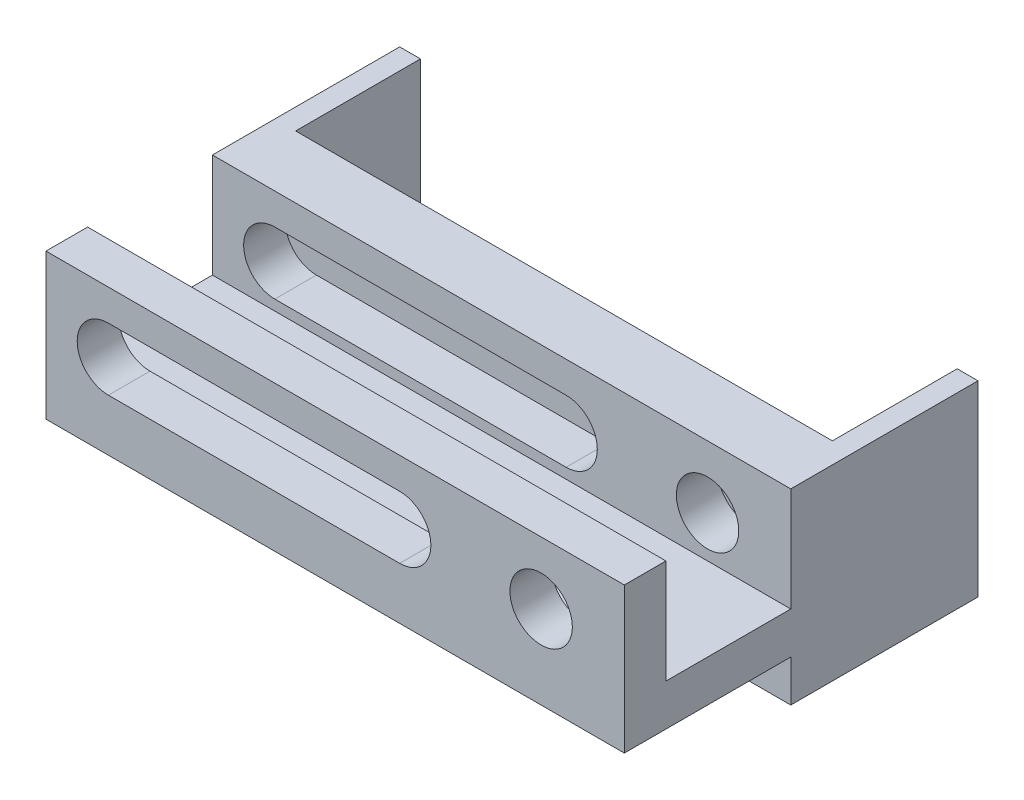
ISO-10303-21;
HEADER;
FILE_DESCRIPTION(('STEP AP214'),'2;1');
FILE_NAME('part.step','',(''),(''),'','','');
FILE_SCHEMA(('AUTOMOTIVE_DESIGN { 1 0 10303 214 1 1 1 1 }'));
ENDSEC;
DATA;
#1=APPLICATION_CONTEXT('core data for automotive mechanical design processes');
#2=APPLICATION_PROTOCOL_DEFINITION('international standard','automotive_design',2000,#1);
#3=PRODUCT_CONTEXT('',#1,'mechanical');
#4=PRODUCT('Part','Part','',(#3));
#5=PRODUCT_RELATED_PRODUCT_CATEGORY('part','',(#4));
#6=PRODUCT_DEFINITION_FORMATION('','',#4);
#7=PRODUCT_DEFINITION_CONTEXT('part definition',#1,'design');
#8=PRODUCT_DEFINITION('design','',#6,#7);
#9=PRODUCT_DEFINITION_SHAPE('','',#8);
#10=(LENGTH_UNIT() NAMED_UNIT(*) SI_UNIT(.MILLI.,.METRE.));
#11=(NAMED_UNIT(*) PLANE_ANGLE_UNIT() SI_UNIT($,.RADIAN.));
#12=(NAMED_UNIT(*) SI_UNIT($,.STERADIAN.) SOLID_ANGLE_UNIT());
#13=UNCERTAINTY_MEASURE_WITH_UNIT(LENGTH_MEASURE(1.E-05),#10,'distance_accuracy_value','');
#14=(GEOMETRIC_REPRESENTATION_CONTEXT(3) GLOBAL_UNCERTAINTY_ASSIGNED_CONTEXT((#13)) GLOBAL_UNIT_ASSIGNED_CONTEXT((#10,
#11,#12)) REPRESENTATION_CONTEXT('',''));
#15=CARTESIAN_POINT('',(0.,0.,0.));
#16=DIRECTION('',(0.,0.,1.));
#17=DIRECTION('',(1.,0.,0.));
#18=AXIS2_PLACEMENT_3D('',#15,#16,#17);
#19=CARTESIAN_POINT('',(139.,0.,-47.1919082003113));
#20=DIRECTION('',(0.,-1.,0.));
#21=DIRECTION('',(0.,0.,-1.));
#22=AXIS2_PLACEMENT_3D('',#19,#20,#21);
#23=PLANE('',#22);
#24=DIRECTION('',(0.,0.,-1.));
#25=VECTOR('',#24,1.);
#26=CARTESIAN_POINT('',(5.,0.,-12.1919082003113));
#27=LINE('',#26,#25);
#28=CARTESIAN_POINT('',(5.,0.,-17.1919082003113));
#29=VERTEX_POINT('',#28);
#30=CARTESIAN_POINT('',(5.,0.,-47.1919082003113));
#31=VERTEX_POINT('',#30);
#32=EDGE_CURVE('E64',#29,#31,#27,.T.);
#33=ORIENTED_EDGE('',*,*,#32,.F.);
#34=DIRECTION('',(-1.,0.,0.));
#35=VECTOR('',#34,1.);
#36=CARTESIAN_POINT('',(5.,0.,-17.1919082003113));
#37=LINE('',#36,#35);
#38=CARTESIAN_POINT('',(134.,0.,-17.1919082003113));
#39=VERTEX_POINT('',#38);
#40=EDGE_CURVE('E202',#39,#29,#37,.T.);
#41=ORIENTED_EDGE('',*,*,#40,.F.);
#42=DIRECTION('',(0.,0.,1.));
#43=VECTOR('',#42,1.);
#44=CARTESIAN_POINT('',(134.,0.,-12.1919082003113));
#45=LINE('',#44,#43);
#46=CARTESIAN_POINT('',(134.,0.,-47.1919082003113));
#47=VERTEX_POINT('',#46);
#48=EDGE_CURVE('E220',#47,#39,#45,.T.);
#49=ORIENTED_EDGE('',*,*,#48,.F.);
#50=DIRECTION('',(-1.,0.,0.));
#51=VECTOR('',#50,1.);
#52=CARTESIAN_POINT('',(139.,0.,-47.1919082003113));
#53=LINE('',#52,#51);
#54=EDGE_CURVE('E359',#47,#31,#53,.T.);
#55=ORIENTED_EDGE('',*,*,#54,.T.);
#56=EDGE_LOOP('',(#33,#41,#49,#55));
#57=FACE_BOUND('',#56,.T.);
#58=ADVANCED_FACE('F41',(#57),#23,.F.);
#59=CARTESIAN_POINT('',(139.,0.,37.8080917996887));
#60=DIRECTION('',(0.,1.,0.));
#61=DIRECTION('',(0.,0.,1.));
#62=AXIS2_PLACEMENT_3D('',#59,#60,#61);
#63=PLANE('',#62);
#64=DIRECTION('',(0.,0.,-1.));
#65=VECTOR('',#64,1.);
#66=CARTESIAN_POINT('',(0.,0.,37.8080917996887));
#67=LINE('',#66,#65);
#68=CARTESIAN_POINT('',(0.,0.,37.8080917996887));
#69=VERTEX_POINT('',#68);
#70=CARTESIAN_POINT('',(0.,0.,-2.19190820031126));
#71=VERTEX_POINT('',#70);
#72=EDGE_CURVE('E299',#69,#71,#67,.T.);
#73=ORIENTED_EDGE('',*,*,#72,.T.);
#74=DIRECTION('',(-1.,0.,0.));
#75=VECTOR('',#74,1.);
#76=CARTESIAN_POINT('',(139.,0.,-2.19190820031126));
#77=LINE('',#76,#75);
#78=CARTESIAN_POINT('',(139.,0.,-2.19190820031126));
#79=VERTEX_POINT('',#78);
#80=EDGE_CURVE('E11',#79,#71,#77,.T.);
#81=ORIENTED_EDGE('',*,*,#80,.F.);
#82=DIRECTION('',(0.,0.,-1.));
#83=VECTOR('',#82,1.);
#84=CARTESIAN_POINT('',(139.,0.,37.8080917996887));
#85=LINE('',#84,#83);
#86=CARTESIAN_POINT('',(139.,0.,37.8080917996887));
#87=VERTEX_POINT('',#86);
#88=EDGE_CURVE('E300',#87,#79,#85,.T.);
#89=ORIENTED_EDGE('',*,*,#88,.F.);
#90=DIRECTION('',(-1.,0.,0.));
#91=VECTOR('',#90,1.);
#92=CARTESIAN_POINT('',(139.,0.,37.8080917996887));
#93=LINE('',#92,#91);
#94=EDGE_CURVE('E322',#87,#69,#93,.T.);
#95=ORIENTED_EDGE('',*,*,#94,.T.);
#96=EDGE_LOOP('',(#73,#81,#89,#95));
#97=FACE_BOUND('',#96,.T.);
#98=ADVANCED_FACE('F43',(#97),#63,.F.);
#99=CARTESIAN_POINT('',(139.,0.,-2.19190820031126));
#100=DIRECTION('',(0.,0.,-1.));
#101=DIRECTION('',(0.,1.,0.));
#102=AXIS2_PLACEMENT_3D('',#99,#100,#101);
#103=PLANE('',#102);
#104=DIRECTION('',(0.,-1.,0.));
#105=VECTOR('',#104,1.);
#106=CARTESIAN_POINT('',(0.,0.,-2.19190820031126));
#107=LINE('',#106,#105);
#108=CARTESIAN_POINT('',(0.,-9.99999999999998,-2.19190820031126));
#109=VERTEX_POINT('',#108);
#110=EDGE_CURVE('E325',#71,#109,#107,.T.);
#111=ORIENTED_EDGE('',*,*,#110,.T.);
#112=DIRECTION('',(-1.,0.,0.));
#113=VECTOR('',#112,1.);
#114=CARTESIAN_POINT('',(139.,-9.99999999999998,-2.19190820031126));
#115=LINE('',#114,#113);
#116=CARTESIAN_POINT('',(139.,-9.99999999999998,-2.19190820031126));
#117=VERTEX_POINT('',#116);
#118=EDGE_CURVE('E49',#117,#109,#115,.T.);
#119=ORIENTED_EDGE('',*,*,#118,.F.);
#120=DIRECTION('',(0.,-1.,0.));
#121=VECTOR('',#120,1.);
#122=CARTESIAN_POINT('',(139.,0.,-2.19190820031126));
#123=LINE('',#122,#121);
#124=EDGE_CURVE('E303',#79,#117,#123,.T.);
#125=ORIENTED_EDGE('',*,*,#124,.F.);
#126=ORIENTED_EDGE('',*,*,#80,.T.);
#127=EDGE_LOOP('',(#111,#119,#125,#126));
#128=FACE_BOUND('',#127,.T.);
#129=ADVANCED_FACE('F412',(#128),#103,.F.);
#130=CARTESIAN_POINT('',(139.,-9.99999999999998,-2.19190820031126));
#131=DIRECTION('',(0.,1.,0.));
#132=DIRECTION('',(0.,0.,1.));
#133=AXIS2_PLACEMENT_3D('',#130,#131,#132);
#134=PLANE('',#133);
#135=DIRECTION('',(0.,0.,-1.));
#136=VECTOR('',#135,1.);
#137=CARTESIAN_POINT('',(0.,-9.99999999999998,-2.19190820031126));
#138=LINE('',#137,#136);
#139=CARTESIAN_POINT('',(0.,-9.99999999999998,-47.1919082003113));
#140=VERTEX_POINT('',#139);
#141=EDGE_CURVE('E327',#109,#140,#138,.T.);
#142=ORIENTED_EDGE('',*,*,#141,.T.);
#143=DIRECTION('',(-1.,0.,0.));
#144=VECTOR('',#143,1.);
#145=CARTESIAN_POINT('',(139.,-9.99999999999998,-47.1919082003113));
#146=LINE('',#145,#144);
#147=CARTESIAN_POINT('',(139.,-9.99999999999998,-47.1919082003113));
#148=VERTEX_POINT('',#147);
#149=EDGE_CURVE('E361',#148,#140,#146,.T.);
#150=ORIENTED_EDGE('',*,*,#149,.F.);
#151=DIRECTION('',(0.,0.,-1.));
#152=VECTOR('',#151,1.);
#153=CARTESIAN_POINT('',(139.,-9.99999999999998,-2.19190820031126));
#154=LINE('',#153,#152);
#155=EDGE_CURVE('E306',#117,#148,#154,.T.);
#156=ORIENTED_EDGE('',*,*,#155,.F.);
#157=ORIENTED_EDGE('',*,*,#118,.T.);
#158=EDGE_LOOP('',(#142,#150,#156,#157));
#159=FACE_BOUND('',#158,.T.);
#160=ADVANCED_FACE('F368',(#159),#134,.F.);
#161=CARTESIAN_POINT('',(139.,-9.99999999999998,-47.1919082003113));
#162=DIRECTION('',(0.,0.,1.));
#163=DIRECTION('',(1.,0.,0.));
#164=AXIS2_PLACEMENT_3D('',#161,#162,#163);
#165=PLANE('',#164);
#166=DIRECTION('',(0.,1.,0.));
#167=VECTOR('',#166,1.);
#168=CARTESIAN_POINT('',(0.,-9.99999999999998,-47.1919082003113));
#169=LINE('',#168,#167);
#170=CARTESIAN_POINT('',(0.,35.0000000000001,-47.1919082003113));
#171=VERTEX_POINT('',#170);
#172=EDGE_CURVE('E329',#140,#171,#169,.T.);
#173=ORIENTED_EDGE('',*,*,#172,.T.);
#174=DIRECTION('',(1.,0.,0.));
#175=VECTOR('',#174,1.);
#176=CARTESIAN_POINT('',(0.,35.0000000000001,-47.1919082003113));
#177=LINE('',#176,#175);
#178=CARTESIAN_POINT('',(5.,35.0000000000001,-47.1919082003113));
#179=VERTEX_POINT('',#178);
#180=EDGE_CURVE('E209',#171,#179,#177,.T.);
#181=ORIENTED_EDGE('',*,*,#180,.T.);
#182=DIRECTION('',(0.,-1.,0.));
#183=VECTOR('',#182,1.);
#184=CARTESIAN_POINT('',(5.,70.3553390593274,-47.1919082003113));
#185=LINE('',#184,#183);
#186=EDGE_CURVE('E206',#179,#31,#185,.T.);
#187=ORIENTED_EDGE('',*,*,#186,.T.);
#188=ORIENTED_EDGE('',*,*,#54,.F.);
#189=DIRECTION('',(0.,-1.,0.));
#190=VECTOR('',#189,1.);
#191=CARTESIAN_POINT('',(134.,70.3553390593274,-47.1919082003113));
#192=LINE('',#191,#190);
#193=CARTESIAN_POINT('',(134.,35.0000000000001,-47.1919082003113));
#194=VERTEX_POINT('',#193);
#195=EDGE_CURVE('E222',#194,#47,#192,.T.);
#196=ORIENTED_EDGE('',*,*,#195,.F.);
#197=DIRECTION('',(1.,0.,0.));
#198=VECTOR('',#197,1.);
#199=CARTESIAN_POINT('',(139.,35.0000000000001,-47.1919082003113));
#200=LINE('',#199,#198);
#201=CARTESIAN_POINT('',(139.,35.0000000000001,-47.1919082003113));
#202=VERTEX_POINT('',#201);
#203=EDGE_CURVE('E226',#194,#202,#200,.T.);
#204=ORIENTED_EDGE('',*,*,#203,.T.);
#205=DIRECTION('',(0.,1.,0.));
#206=VECTOR('',#205,1.);
#207=CARTESIAN_POINT('',(139.,-9.99999999999998,-47.1919082003113));
#208=LINE('',#207,#206);
#209=EDGE_CURVE('E308',#148,#202,#208,.T.);
#210=ORIENTED_EDGE('',*,*,#209,.F.);
#211=ORIENTED_EDGE('',*,*,#149,.T.);
#212=EDGE_LOOP('',(#173,#181,#187,#188,#196,#204,#210,#211));
#213=FACE_BOUND('',#212,.T.);
#214=ADVANCED_FACE('F378',(#213),#165,.F.);
#215=CARTESIAN_POINT('',(139.,35.,-2.19190820031126));
#216=DIRECTION('',(0.,-1.,0.));
#217=DIRECTION('',(0.,0.,-1.));
#218=AXIS2_PLACEMENT_3D('',#215,#216,#217);
#219=PLANE('',#218);
#220=DIRECTION('',(0.,0.,1.));
#221=VECTOR('',#220,1.);
#222=CARTESIAN_POINT('',(0.,35.,-2.19190820031126));
#223=LINE('',#222,#221);
#224=CARTESIAN_POINT('',(0.,35.,-2.19190820031126));
#225=VERTEX_POINT('',#224);
#226=EDGE_CURVE('E331',#171,#225,#223,.T.);
#227=ORIENTED_EDGE('',*,*,#226,.T.);
#228=DIRECTION('',(-1.,0.,0.));
#229=VECTOR('',#228,1.);
#230=CARTESIAN_POINT('',(139.,35.,-2.19190820031126));
#231=LINE('',#230,#229);
#232=CARTESIAN_POINT('',(139.,35.,-2.19190820031126));
#233=VERTEX_POINT('',#232);
#234=EDGE_CURVE('E356',#233,#225,#231,.T.);
#235=ORIENTED_EDGE('',*,*,#234,.F.);
#236=DIRECTION('',(0.,0.,1.));
#237=VECTOR('',#236,1.);
#238=CARTESIAN_POINT('',(139.,35.,-2.19190820031126));
#239=LINE('',#238,#237);
#240=EDGE_CURVE('E310',#202,#233,#239,.T.);
#241=ORIENTED_EDGE('',*,*,#240,.F.);
#242=ORIENTED_EDGE('',*,*,#203,.F.);
#243=DIRECTION('',(0.,0.,-1.));
#244=VECTOR('',#243,1.);
#245=CARTESIAN_POINT('',(134.,35.,-12.1919082003113));
#246=LINE('',#245,#244);
#247=CARTESIAN_POINT('',(134.,35.,-17.1919082003113));
#248=VERTEX_POINT('',#247);
#249=EDGE_CURVE('E196',#248,#194,#246,.T.);
#250=ORIENTED_EDGE('',*,*,#249,.F.);
#251=DIRECTION('',(1.,0.,0.));
#252=VECTOR('',#251,1.);
#253=CARTESIAN_POINT('',(5.,35.,-17.1919082003113));
#254=LINE('',#253,#252);
#255=CARTESIAN_POINT('',(5.,35.,-17.1919082003113));
#256=VERTEX_POINT('',#255);
#257=EDGE_CURVE('E56',#256,#248,#254,.T.);
#258=ORIENTED_EDGE('',*,*,#257,.F.);
#259=DIRECTION('',(0.,0.,1.));
#260=VECTOR('',#259,1.);
#261=CARTESIAN_POINT('',(5.,35.,-12.1919082003113));
#262=LINE('',#261,#260);
#263=EDGE_CURVE('E194',#179,#256,#262,.T.);
#264=ORIENTED_EDGE('',*,*,#263,.F.);
#265=ORIENTED_EDGE('',*,*,#180,.F.);
#266=EDGE_LOOP('',(#227,#235,#241,#242,#250,#258,#264,#265));
#267=FACE_BOUND('',#266,.T.);
#268=ADVANCED_FACE('F191',(#267),#219,.F.);
#269=CARTESIAN_POINT('',(139.,10.,-2.19190820031126));
#270=DIRECTION('',(0.,0.,-1.));
#271=DIRECTION('',(0.,1.,0.));
#272=AXIS2_PLACEMENT_3D('',#269,#270,#271);
#273=PLANE('',#272);
#274=CARTESIAN_POINT('',(119.,20.,-2.19190820031126));
#275=DIRECTION('',(0.,0.,-1.));
#276=DIRECTION('',(0.,1.,0.));
#277=AXIS2_PLACEMENT_3D('',#274,#275,#276);
#278=CIRCLE('',#277,7.49999999999998);
#279=CARTESIAN_POINT('',(119.,27.5,-2.19190820031126));
#280=VERTEX_POINT('',#279);
#281=EDGE_CURVE('E296',#280,#280,#278,.T.);
#282=ORIENTED_EDGE('',*,*,#281,.T.);
#283=EDGE_LOOP('',(#282));
#284=FACE_BOUND('',#283,.T.);
#285=DIRECTION('',(1.,0.,0.));
#286=VECTOR('',#285,1.);
#287=CARTESIAN_POINT('',(139.,27.5,-2.19190820031126));
#288=LINE('',#287,#286);
#289=CARTESIAN_POINT('',(15.,27.5,-2.19190820031126));
#290=VERTEX_POINT('',#289);
#291=CARTESIAN_POINT('',(85.,27.5,-2.19190820031126));
#292=VERTEX_POINT('',#291);
#293=EDGE_CURVE('E284',#290,#292,#288,.T.);
#294=ORIENTED_EDGE('',*,*,#293,.T.);
#295=CARTESIAN_POINT('',(85.,20.,-2.19190820031126));
#296=DIRECTION('',(0.,0.,-1.));
#297=DIRECTION('',(0.,1.,0.));
#298=AXIS2_PLACEMENT_3D('',#295,#296,#297);
#299=CIRCLE('',#298,7.5);
#300=CARTESIAN_POINT('',(85.,12.5,-2.19190820031126));
#301=VERTEX_POINT('',#300);
#302=EDGE_CURVE('E290',#292,#301,#299,.T.);
#303=ORIENTED_EDGE('',*,*,#302,.T.);
#304=DIRECTION('',(-1.,0.,0.));
#305=VECTOR('',#304,1.);
#306=CARTESIAN_POINT('',(139.,12.5,-2.19190820031126));
#307=LINE('',#306,#305);
#308=CARTESIAN_POINT('',(15.,12.5,-2.19190820031126));
#309=VERTEX_POINT('',#308);
#310=EDGE_CURVE('E272',#301,#309,#307,.T.);
#311=ORIENTED_EDGE('',*,*,#310,.T.);
#312=CARTESIAN_POINT('',(15.,20.,-2.19190820031126));
#313=DIRECTION('',(0.,0.,-1.));
#314=DIRECTION('',(0.,1.,0.));
#315=AXIS2_PLACEMENT_3D('',#312,#313,#314);
#316=CIRCLE('',#315,7.5);
#317=EDGE_CURVE('E278',#309,#290,#316,.T.);
#318=ORIENTED_EDGE('',*,*,#317,.T.);
#319=EDGE_LOOP('',(#294,#303,#311,#318));
#320=FACE_BOUND('',#319,.T.);
#321=DIRECTION('',(0.,-1.,0.));
#322=VECTOR('',#321,1.);
#323=CARTESIAN_POINT('',(0.,10.,-2.19190820031126));
#324=LINE('',#323,#322);
#325=CARTESIAN_POINT('',(0.,10.,-2.19190820031126));
#326=VERTEX_POINT('',#325);
#327=EDGE_CURVE('E333',#225,#326,#324,.T.);
#328=ORIENTED_EDGE('',*,*,#327,.T.);
#329=DIRECTION('',(-1.,0.,0.));
#330=VECTOR('',#329,1.);
#331=CARTESIAN_POINT('',(139.,10.,-2.19190820031126));
#332=LINE('',#331,#330);
#333=CARTESIAN_POINT('',(139.,10.,-2.19190820031126));
#334=VERTEX_POINT('',#333);
#335=EDGE_CURVE('E353',#334,#326,#332,.T.);
#336=ORIENTED_EDGE('',*,*,#335,.F.);
#337=DIRECTION('',(0.,-1.,0.));
#338=VECTOR('',#337,1.);
#339=CARTESIAN_POINT('',(139.,10.,-2.19190820031126));
#340=LINE('',#339,#338);
#341=EDGE_CURVE('E312',#233,#334,#340,.T.);
#342=ORIENTED_EDGE('',*,*,#341,.F.);
#343=ORIENTED_EDGE('',*,*,#234,.T.);
#344=EDGE_LOOP('',(#328,#336,#342,#343));
#345=FACE_BOUND('',#344,.T.);
#346=ADVANCED_FACE('F388',(#284,#320,#345),#273,.F.);
#347=CARTESIAN_POINT('',(139.,10.,27.8080917996887));
#348=DIRECTION('',(0.,-1.,0.));
#349=DIRECTION('',(0.,0.,-1.));
#350=AXIS2_PLACEMENT_3D('',#347,#348,#349);
#351=PLANE('',#350);
#352=DIRECTION('',(0.,0.,1.));
#353=VECTOR('',#352,1.);
#354=CARTESIAN_POINT('',(0.,10.,27.8080917996887));
#355=LINE('',#354,#353);
#356=CARTESIAN_POINT('',(0.,10.,27.8080917996887));
#357=VERTEX_POINT('',#356);
#358=EDGE_CURVE('E335',#326,#357,#355,.T.);
#359=ORIENTED_EDGE('',*,*,#358,.T.);
#360=DIRECTION('',(-1.,0.,0.));
#361=VECTOR('',#360,1.);
#362=CARTESIAN_POINT('',(139.,10.,27.8080917996887));
#363=LINE('',#362,#361);
#364=CARTESIAN_POINT('',(139.,10.,27.8080917996887));
#365=VERTEX_POINT('',#364);
#366=EDGE_CURVE('E350',#365,#357,#363,.T.);
#367=ORIENTED_EDGE('',*,*,#366,.F.);
#368=DIRECTION('',(0.,0.,1.));
#369=VECTOR('',#368,1.);
#370=CARTESIAN_POINT('',(139.,10.,27.8080917996887));
#371=LINE('',#370,#369);
#372=EDGE_CURVE('E314',#334,#365,#371,.T.);
#373=ORIENTED_EDGE('',*,*,#372,.F.);
#374=ORIENTED_EDGE('',*,*,#335,.T.);
#375=EDGE_LOOP('',(#359,#367,#373,#374));
#376=FACE_BOUND('',#375,.T.);
#377=ADVANCED_FACE('F394',(#376),#351,.F.);
#378=CARTESIAN_POINT('',(139.,35.,27.8080917996887));
#379=DIRECTION('',(0.,0.,1.));
#380=DIRECTION('',(0.,-1.,0.));
#381=AXIS2_PLACEMENT_3D('',#378,#379,#380);
#382=PLANE('',#381);
#383=CARTESIAN_POINT('',(119.,20.,27.8080917996887));
#384=DIRECTION('',(0.,0.,1.));
#385=DIRECTION('',(0.,-1.,0.));
#386=AXIS2_PLACEMENT_3D('',#383,#384,#385);
#387=CIRCLE('',#386,7.49999999999998);
#388=CARTESIAN_POINT('',(119.,12.5,27.8080917996887));
#389=VERTEX_POINT('',#388);
#390=EDGE_CURVE('E293',#389,#389,#387,.T.);
#391=ORIENTED_EDGE('',*,*,#390,.T.);
#392=EDGE_LOOP('',(#391));
#393=FACE_BOUND('',#392,.T.);
#394=DIRECTION('',(1.,0.,0.));
#395=VECTOR('',#394,1.);
#396=CARTESIAN_POINT('',(139.,12.5,27.8080917996887));
#397=LINE('',#396,#395);
#398=CARTESIAN_POINT('',(15.,12.5,27.8080917996887));
#399=VERTEX_POINT('',#398);
#400=CARTESIAN_POINT('',(85.,12.5,27.8080917996887));
#401=VERTEX_POINT('',#400);
#402=EDGE_CURVE('E233',#399,#401,#397,.T.);
#403=ORIENTED_EDGE('',*,*,#402,.T.);
#404=CARTESIAN_POINT('',(85.,20.,27.8080917996887));
#405=DIRECTION('',(0.,0.,1.));
#406=DIRECTION('',(0.,-1.,0.));
#407=AXIS2_PLACEMENT_3D('',#404,#405,#406);
#408=CIRCLE('',#407,7.5);
#409=CARTESIAN_POINT('',(85.,27.5,27.8080917996887));
#410=VERTEX_POINT('',#409);
#411=EDGE_CURVE('E287',#401,#410,#408,.T.);
#412=ORIENTED_EDGE('',*,*,#411,.T.);
#413=DIRECTION('',(-1.,0.,0.));
#414=VECTOR('',#413,1.);
#415=CARTESIAN_POINT('',(139.,27.5,27.8080917996887));
#416=LINE('',#415,#414);
#417=CARTESIAN_POINT('',(15.,27.5,27.8080917996887));
#418=VERTEX_POINT('',#417);
#419=EDGE_CURVE('E281',#410,#418,#416,.T.);
#420=ORIENTED_EDGE('',*,*,#419,.T.);
#421=CARTESIAN_POINT('',(15.,20.,27.8080917996887));
#422=DIRECTION('',(0.,0.,1.));
#423=DIRECTION('',(0.,-1.,0.));
#424=AXIS2_PLACEMENT_3D('',#421,#422,#423);
#425=CIRCLE('',#424,7.5);
#426=EDGE_CURVE('E275',#418,#399,#425,.T.);
#427=ORIENTED_EDGE('',*,*,#426,.T.);
#428=EDGE_LOOP('',(#403,#412,#420,#427));
#429=FACE_BOUND('',#428,.T.);
#430=DIRECTION('',(0.,1.,0.));
#431=VECTOR('',#430,1.);
#432=CARTESIAN_POINT('',(0.,35.,27.8080917996887));
#433=LINE('',#432,#431);
#434=CARTESIAN_POINT('',(0.,35.,27.8080917996887));
#435=VERTEX_POINT('',#434);
#436=EDGE_CURVE('E337',#357,#435,#433,.T.);
#437=ORIENTED_EDGE('',*,*,#436,.T.);
#438=DIRECTION('',(-1.,0.,0.));
#439=VECTOR('',#438,1.);
#440=CARTESIAN_POINT('',(139.,35.,27.8080917996887));
#441=LINE('',#440,#439);
#442=CARTESIAN_POINT('',(139.,35.,27.8080917996887));
#443=VERTEX_POINT('',#442);
#444=EDGE_CURVE('E347',#443,#435,#441,.T.);
#445=ORIENTED_EDGE('',*,*,#444,.F.);
#446=DIRECTION('',(0.,1.,0.));
#447=VECTOR('',#446,1.);
#448=CARTESIAN_POINT('',(139.,35.,27.8080917996887));
#449=LINE('',#448,#447);
#450=EDGE_CURVE('E316',#365,#443,#449,.T.);
#451=ORIENTED_EDGE('',*,*,#450,.F.);
#452=ORIENTED_EDGE('',*,*,#366,.T.);
#453=EDGE_LOOP('',(#437,#445,#451,#452));
#454=FACE_BOUND('',#453,.T.);
#455=ADVANCED_FACE('F398',(#393,#429,#454),#382,.F.);
#456=CARTESIAN_POINT('',(139.,35.,37.8080917996887));
#457=DIRECTION('',(0.,-1.,0.));
#458=DIRECTION('',(0.,0.,-1.));
#459=AXIS2_PLACEMENT_3D('',#456,#457,#458);
#460=PLANE('',#459);
#461=DIRECTION('',(0.,0.,1.));
#462=VECTOR('',#461,1.);
#463=CARTESIAN_POINT('',(0.,35.,37.8080917996887));
#464=LINE('',#463,#462);
#465=CARTESIAN_POINT('',(0.,35.,37.8080917996887));
#466=VERTEX_POINT('',#465);
#467=EDGE_CURVE('E339',#435,#466,#464,.T.);
#468=ORIENTED_EDGE('',*,*,#467,.T.);
#469=DIRECTION('',(-1.,0.,0.));
#470=VECTOR('',#469,1.);
#471=CARTESIAN_POINT('',(139.,35.,37.8080917996887));
#472=LINE('',#471,#470);
#473=CARTESIAN_POINT('',(139.,35.,37.8080917996887));
#474=VERTEX_POINT('',#473);
#475=EDGE_CURVE('E344',#474,#466,#472,.T.);
#476=ORIENTED_EDGE('',*,*,#475,.F.);
#477=DIRECTION('',(0.,0.,1.));
#478=VECTOR('',#477,1.);
#479=CARTESIAN_POINT('',(139.,35.,37.8080917996887));
#480=LINE('',#479,#478);
#481=EDGE_CURVE('E318',#443,#474,#480,.T.);
#482=ORIENTED_EDGE('',*,*,#481,.F.);
#483=ORIENTED_EDGE('',*,*,#444,.T.);
#484=EDGE_LOOP('',(#468,#476,#482,#483));
#485=FACE_BOUND('',#484,.T.);
#486=ADVANCED_FACE('F403',(#485),#460,.F.);
#487=CARTESIAN_POINT('',(139.,0.,37.8080917996887));
#488=DIRECTION('',(0.,0.,-1.));
#489=DIRECTION('',(-1.,0.,0.));
#490=AXIS2_PLACEMENT_3D('',#487,#488,#489);
#491=PLANE('',#490);
#492=CARTESIAN_POINT('',(119.,20.,37.8080917996887));
#493=DIRECTION('',(0.,0.,-1.));
#494=DIRECTION('',(0.,1.,0.));
#495=AXIS2_PLACEMENT_3D('',#492,#493,#494);
#496=CIRCLE('',#495,7.49999999999998);
#497=CARTESIAN_POINT('',(119.,27.5,37.8080917996887));
#498=VERTEX_POINT('',#497);
#499=EDGE_CURVE('E230',#498,#498,#496,.T.);
#500=ORIENTED_EDGE('',*,*,#499,.T.);
#501=EDGE_LOOP('',(#500));
#502=FACE_BOUND('',#501,.T.);
#503=DIRECTION('',(1.,0.,0.));
#504=VECTOR('',#503,1.);
#505=CARTESIAN_POINT('',(85.,27.5,37.8080917996888));
#506=LINE('',#505,#504);
#507=CARTESIAN_POINT('',(15.,27.5,37.8080917996888));
#508=VERTEX_POINT('',#507);
#509=CARTESIAN_POINT('',(85.,27.5,37.8080917996888));
#510=VERTEX_POINT('',#509);
#511=EDGE_CURVE('E237',#508,#510,#506,.T.);
#512=ORIENTED_EDGE('',*,*,#511,.T.);
#513=CARTESIAN_POINT('',(85.,20.,37.8080917996887));
#514=DIRECTION('',(0.,0.,-1.));
#515=DIRECTION('',(0.,1.,0.));
#516=AXIS2_PLACEMENT_3D('',#513,#514,#515);
#517=CIRCLE('',#516,7.5);
#518=CARTESIAN_POINT('',(85.,12.5,37.8080917996887));
#519=VERTEX_POINT('',#518);
#520=EDGE_CURVE('E252',#510,#519,#517,.T.);
#521=ORIENTED_EDGE('',*,*,#520,.T.);
#522=DIRECTION('',(-1.,0.,0.));
#523=VECTOR('',#522,1.);
#524=CARTESIAN_POINT('',(85.,12.5,37.8080917996887));
#525=LINE('',#524,#523);
#526=CARTESIAN_POINT('',(15.,12.5,37.8080917996887));
#527=VERTEX_POINT('',#526);
#528=EDGE_CURVE('E265',#519,#527,#525,.T.);
#529=ORIENTED_EDGE('',*,*,#528,.T.);
#530=CARTESIAN_POINT('',(15.,20.,37.8080917996887));
#531=DIRECTION('',(0.,0.,-1.));
#532=DIRECTION('',(0.,1.,0.));
#533=AXIS2_PLACEMENT_3D('',#530,#531,#532);
#534=CIRCLE('',#533,7.5);
#535=EDGE_CURVE('E262',#527,#508,#534,.T.);
#536=ORIENTED_EDGE('',*,*,#535,.T.);
#537=EDGE_LOOP('',(#512,#521,#529,#536));
#538=FACE_BOUND('',#537,.T.);
#539=DIRECTION('',(0.,-1.,0.));
#540=VECTOR('',#539,1.);
#541=CARTESIAN_POINT('',(0.,0.,37.8080917996887));
#542=LINE('',#541,#540);
#543=EDGE_CURVE('E304',#466,#69,#542,.T.);
#544=ORIENTED_EDGE('',*,*,#543,.T.);
#545=ORIENTED_EDGE('',*,*,#94,.F.);
#546=DIRECTION('',(0.,-1.,0.));
#547=VECTOR('',#546,1.);
#548=CARTESIAN_POINT('',(139.,0.,37.8080917996887));
#549=LINE('',#548,#547);
#550=EDGE_CURVE('E320',#474,#87,#549,.T.);
#551=ORIENTED_EDGE('',*,*,#550,.F.);
#552=ORIENTED_EDGE('',*,*,#475,.T.);
#553=EDGE_LOOP('',(#544,#545,#551,#552));
#554=FACE_BOUND('',#553,.T.);
#555=ADVANCED_FACE('F409',(#502,#538,#554),#491,.F.);
#556=CARTESIAN_POINT('',(139.,0.,0.));
#557=DIRECTION('',(-1.,0.,0.));
#558=DIRECTION('',(0.,0.,1.));
#559=AXIS2_PLACEMENT_3D('',#556,#557,#558);
#560=PLANE('',#559);
#561=ORIENTED_EDGE('',*,*,#88,.T.);
#562=ORIENTED_EDGE('',*,*,#124,.T.);
#563=ORIENTED_EDGE('',*,*,#155,.T.);
#564=ORIENTED_EDGE('',*,*,#209,.T.);
#565=ORIENTED_EDGE('',*,*,#240,.T.);
#566=ORIENTED_EDGE('',*,*,#341,.T.);
#567=ORIENTED_EDGE('',*,*,#372,.T.);
#568=ORIENTED_EDGE('',*,*,#450,.T.);
#569=ORIENTED_EDGE('',*,*,#481,.T.);
#570=ORIENTED_EDGE('',*,*,#550,.T.);
#571=EDGE_LOOP('',(#561,#562,#563,#564,#565,#566,#567,#568,#569,#570));
#572=FACE_BOUND('',#571,.T.);
#573=ADVANCED_FACE('F383',(#572),#560,.F.);
#574=CARTESIAN_POINT('',(0.,0.,0.));
#575=DIRECTION('',(-1.,0.,0.));
#576=DIRECTION('',(0.,0.,1.));
#577=AXIS2_PLACEMENT_3D('',#574,#575,#576);
#578=PLANE('',#577);
#579=ORIENTED_EDGE('',*,*,#72,.F.);
#580=ORIENTED_EDGE('',*,*,#543,.F.);
#581=ORIENTED_EDGE('',*,*,#467,.F.);
#582=ORIENTED_EDGE('',*,*,#436,.F.);
#583=ORIENTED_EDGE('',*,*,#358,.F.);
#584=ORIENTED_EDGE('',*,*,#327,.F.);
#585=ORIENTED_EDGE('',*,*,#226,.F.);
#586=ORIENTED_EDGE('',*,*,#172,.F.);
#587=ORIENTED_EDGE('',*,*,#141,.F.);
#588=ORIENTED_EDGE('',*,*,#110,.F.);
#589=EDGE_LOOP('',(#579,#580,#581,#582,#583,#584,#585,#586,#587,#588));
#590=FACE_BOUND('',#589,.T.);
#591=ADVANCED_FACE('F374',(#590),#578,.T.);
#592=CARTESIAN_POINT('',(85.,12.5,37.8080917996887));
#593=DIRECTION('',(0.,-1.,0.));
#594=DIRECTION('',(0.,0.,-1.));
#595=AXIS2_PLACEMENT_3D('',#592,#593,#594);
#596=PLANE('',#595);
#597=DIRECTION('',(0.,0.,-1.));
#598=VECTOR('',#597,1.);
#599=CARTESIAN_POINT('',(15.,12.5,37.8080917996887));
#600=LINE('',#599,#598);
#601=EDGE_CURVE('E239',#527,#399,#600,.T.);
#602=ORIENTED_EDGE('',*,*,#601,.F.);
#603=ORIENTED_EDGE('',*,*,#528,.F.);
#604=DIRECTION('',(0.,0.,-1.));
#605=VECTOR('',#604,1.);
#606=CARTESIAN_POINT('',(85.,12.5,37.8080917996887));
#607=LINE('',#606,#605);
#608=EDGE_CURVE('E235',#519,#401,#607,.T.);
#609=ORIENTED_EDGE('',*,*,#608,.T.);
#610=ORIENTED_EDGE('',*,*,#402,.F.);
#611=EDGE_LOOP('',(#602,#603,#609,#610));
#612=FACE_BOUND('',#611,.T.);
#613=ADVANCED_FACE('F454',(#612),#596,.F.);
#614=CARTESIAN_POINT('',(15.,20.,37.8080917996887));
#615=DIRECTION('',(0.,0.,-1.));
#616=DIRECTION('',(0.,1.,0.));
#617=AXIS2_PLACEMENT_3D('',#614,#615,#616);
#618=CYLINDRICAL_SURFACE('',#617,7.5);
#619=DIRECTION('',(0.,0.,-1.));
#620=VECTOR('',#619,1.);
#621=CARTESIAN_POINT('',(15.,27.5,37.8080917996888));
#622=LINE('',#621,#620);
#623=EDGE_CURVE('E243',#508,#418,#622,.T.);
#624=ORIENTED_EDGE('',*,*,#623,.F.);
#625=ORIENTED_EDGE('',*,*,#535,.F.);
#626=ORIENTED_EDGE('',*,*,#601,.T.);
#627=ORIENTED_EDGE('',*,*,#426,.F.);
#628=EDGE_LOOP('',(#624,#625,#626,#627));
#629=FACE_BOUND('',#628,.T.);
#630=ADVANCED_FACE('F467',(#629),#618,.F.);
#631=CARTESIAN_POINT('',(85.,27.5,37.8080917996888));
#632=DIRECTION('',(0.,1.,0.));
#633=DIRECTION('',(0.,0.,1.));
#634=AXIS2_PLACEMENT_3D('',#631,#632,#633);
#635=PLANE('',#634);
#636=DIRECTION('',(0.,0.,-1.));
#637=VECTOR('',#636,1.);
#638=CARTESIAN_POINT('',(85.,27.5,37.8080917996888));
#639=LINE('',#638,#637);
#640=EDGE_CURVE('E212',#510,#410,#639,.T.);
#641=ORIENTED_EDGE('',*,*,#640,.F.);
#642=ORIENTED_EDGE('',*,*,#511,.F.);
#643=ORIENTED_EDGE('',*,*,#623,.T.);
#644=ORIENTED_EDGE('',*,*,#419,.F.);
#645=EDGE_LOOP('',(#641,#642,#643,#644));
#646=FACE_BOUND('',#645,.T.);
#647=ADVANCED_FACE('F462',(#646),#635,.F.);
#648=CARTESIAN_POINT('',(85.,20.,37.8080917996887));
#649=DIRECTION('',(0.,0.,-1.));
#650=DIRECTION('',(0.,1.,0.));
#651=AXIS2_PLACEMENT_3D('',#648,#649,#650);
#652=CYLINDRICAL_SURFACE('',#651,7.5);
#653=ORIENTED_EDGE('',*,*,#608,.F.);
#654=ORIENTED_EDGE('',*,*,#520,.F.);
#655=ORIENTED_EDGE('',*,*,#640,.T.);
#656=ORIENTED_EDGE('',*,*,#411,.F.);
#657=EDGE_LOOP('',(#653,#654,#655,#656));
#658=FACE_BOUND('',#657,.T.);
#659=ADVANCED_FACE('F475',(#658),#652,.F.);
#660=CARTESIAN_POINT('',(119.,20.,37.8080917996887));
#661=DIRECTION('',(0.,0.,-1.));
#662=DIRECTION('',(0.,1.,0.));
#663=AXIS2_PLACEMENT_3D('',#660,#661,#662);
#664=CYLINDRICAL_SURFACE('',#663,7.49999999999998);
#665=ORIENTED_EDGE('',*,*,#499,.F.);
#666=EDGE_LOOP('',(#665));
#667=FACE_BOUND('',#666,.T.);
#668=ORIENTED_EDGE('',*,*,#390,.F.);
#669=EDGE_LOOP('',(#668));
#670=FACE_BOUND('',#669,.T.);
#671=ADVANCED_FACE('F473',(#667,#670),#664,.F.);
#672=CARTESIAN_POINT('',(85.,27.5,-12.1919082003113));
#673=VERTEX_POINT('',#672);
#674=EDGE_CURVE('E208',#292,#673,#639,.T.);
#675=ORIENTED_EDGE('',*,*,#674,.T.);
#676=CARTESIAN_POINT('',(85.,20.,-12.1919082003113));
#677=DIRECTION('',(0.,0.,-1.));
#678=DIRECTION('',(0.,1.,0.));
#679=AXIS2_PLACEMENT_3D('',#676,#677,#678);
#680=CIRCLE('',#679,7.5);
#681=CARTESIAN_POINT('',(85.,12.5,-12.1919082003113));
#682=VERTEX_POINT('',#681);
#683=EDGE_CURVE('E234',#673,#682,#680,.T.);
#684=ORIENTED_EDGE('',*,*,#683,.T.);
#685=EDGE_CURVE('E238',#301,#682,#607,.T.);
#686=ORIENTED_EDGE('',*,*,#685,.F.);
#687=ORIENTED_EDGE('',*,*,#302,.F.);
#688=EDGE_LOOP('',(#675,#684,#686,#687));
#689=FACE_BOUND('',#688,.T.);
#690=ADVANCED_FACE('F460',(#689),#652,.F.);
#691=CARTESIAN_POINT('',(15.,27.5,-12.1919082003113));
#692=VERTEX_POINT('',#691);
#693=EDGE_CURVE('E245',#290,#692,#622,.T.);
#694=ORIENTED_EDGE('',*,*,#693,.T.);
#695=DIRECTION('',(1.,0.,0.));
#696=VECTOR('',#695,1.);
#697=CARTESIAN_POINT('',(85.,27.5,-12.1919082003112));
#698=LINE('',#697,#696);
#699=EDGE_CURVE('E248',#692,#673,#698,.T.);
#700=ORIENTED_EDGE('',*,*,#699,.T.);
#701=ORIENTED_EDGE('',*,*,#674,.F.);
#702=ORIENTED_EDGE('',*,*,#293,.F.);
#703=EDGE_LOOP('',(#694,#700,#701,#702));
#704=FACE_BOUND('',#703,.T.);
#705=ADVANCED_FACE('F456',(#704),#635,.F.);
#706=CARTESIAN_POINT('',(15.,12.5,-12.1919082003113));
#707=VERTEX_POINT('',#706);
#708=EDGE_CURVE('E242',#309,#707,#600,.T.);
#709=ORIENTED_EDGE('',*,*,#708,.T.);
#710=CARTESIAN_POINT('',(15.,20.,-12.1919082003113));
#711=DIRECTION('',(0.,0.,-1.));
#712=DIRECTION('',(0.,1.,0.));
#713=AXIS2_PLACEMENT_3D('',#710,#711,#712);
#714=CIRCLE('',#713,7.5);
#715=EDGE_CURVE('E251',#707,#692,#714,.T.);
#716=ORIENTED_EDGE('',*,*,#715,.T.);
#717=ORIENTED_EDGE('',*,*,#693,.F.);
#718=ORIENTED_EDGE('',*,*,#317,.F.);
#719=EDGE_LOOP('',(#709,#716,#717,#718));
#720=FACE_BOUND('',#719,.T.);
#721=ADVANCED_FACE('F459',(#720),#618,.F.);
#722=ORIENTED_EDGE('',*,*,#685,.T.);
#723=DIRECTION('',(-1.,0.,0.));
#724=VECTOR('',#723,1.);
#725=CARTESIAN_POINT('',(85.,12.5,-12.1919082003113));
#726=LINE('',#725,#724);
#727=EDGE_CURVE('E255',#682,#707,#726,.T.);
#728=ORIENTED_EDGE('',*,*,#727,.T.);
#729=ORIENTED_EDGE('',*,*,#708,.F.);
#730=ORIENTED_EDGE('',*,*,#310,.F.);
#731=EDGE_LOOP('',(#722,#728,#729,#730));
#732=FACE_BOUND('',#731,.T.);
#733=ADVANCED_FACE('F465',(#732),#596,.F.);
#734=CARTESIAN_POINT('',(119.,20.,-12.1919082003113));
#735=DIRECTION('',(0.,0.,-1.));
#736=DIRECTION('',(-1.,0.,0.));
#737=AXIS2_PLACEMENT_3D('',#734,#735,#736);
#738=CIRCLE('',#737,7.49999999999998);
#739=CARTESIAN_POINT('',(111.5,20.,-12.1919082003113));
#740=VERTEX_POINT('',#739);
#741=EDGE_CURVE('E217',#740,#740,#738,.F.);
#742=ORIENTED_EDGE('',*,*,#741,.F.);
#743=EDGE_LOOP('',(#742));
#744=FACE_BOUND('',#743,.T.);
#745=ORIENTED_EDGE('',*,*,#281,.F.);
#746=EDGE_LOOP('',(#745));
#747=FACE_BOUND('',#746,.T.);
#748=ADVANCED_FACE('F470',(#744,#747),#664,.F.);
#749=CARTESIAN_POINT('',(5.,70.3553390593274,-12.1919082003113));
#750=DIRECTION('',(-1.,0.,0.));
#751=DIRECTION('',(0.,0.,1.));
#752=AXIS2_PLACEMENT_3D('',#749,#750,#751);
#753=PLANE('',#752);
#754=ORIENTED_EDGE('',*,*,#263,.T.);
#755=DIRECTION('',(0.,1.,0.));
#756=VECTOR('',#755,1.);
#757=CARTESIAN_POINT('',(5.,0.,-17.1919082003113));
#758=LINE('',#757,#756);
#759=EDGE_CURVE('E198',#29,#256,#758,.T.);
#760=ORIENTED_EDGE('',*,*,#759,.F.);
#761=ORIENTED_EDGE('',*,*,#32,.T.);
#762=ORIENTED_EDGE('',*,*,#186,.F.);
#763=EDGE_LOOP('',(#754,#760,#761,#762));
#764=FACE_BOUND('',#763,.T.);
#765=ADVANCED_FACE('F204',(#764),#753,.F.);
#766=CARTESIAN_POINT('',(134.,70.3553390593274,-12.1919082003113));
#767=DIRECTION('',(1.,0.,0.));
#768=DIRECTION('',(0.,0.,-1.));
#769=AXIS2_PLACEMENT_3D('',#766,#767,#768);
#770=PLANE('',#769);
#771=ORIENTED_EDGE('',*,*,#48,.T.);
#772=DIRECTION('',(0.,-1.,0.));
#773=VECTOR('',#772,1.);
#774=CARTESIAN_POINT('',(134.,0.,-17.1919082003113));
#775=LINE('',#774,#773);
#776=EDGE_CURVE('E197',#248,#39,#775,.T.);
#777=ORIENTED_EDGE('',*,*,#776,.F.);
#778=ORIENTED_EDGE('',*,*,#249,.T.);
#779=ORIENTED_EDGE('',*,*,#195,.T.);
#780=EDGE_LOOP('',(#771,#777,#778,#779));
#781=FACE_BOUND('',#780,.T.);
#782=ADVANCED_FACE('F478',(#781),#770,.F.);
#783=CARTESIAN_POINT('',(0.,0.,-17.1919082003113));
#784=DIRECTION('',(0.,0.,-1.));
#785=DIRECTION('',(-1.,0.,0.));
#786=AXIS2_PLACEMENT_3D('',#783,#784,#785);
#787=PLANE('',#786);
#788=ORIENTED_EDGE('',*,*,#759,.T.);
#789=ORIENTED_EDGE('',*,*,#257,.T.);
#790=ORIENTED_EDGE('',*,*,#776,.T.);
#791=ORIENTED_EDGE('',*,*,#40,.T.);
#792=EDGE_LOOP('',(#788,#789,#790,#791));
#793=FACE_BOUND('',#792,.T.);
#794=ADVANCED_FACE('F200',(#793),#787,.T.);
#795=CARTESIAN_POINT('',(0.,0.,-12.1919082003113));
#796=DIRECTION('',(0.,0.,-1.));
#797=DIRECTION('',(-1.,0.,0.));
#798=AXIS2_PLACEMENT_3D('',#795,#796,#797);
#799=PLANE('',#798);
#800=ORIENTED_EDGE('',*,*,#741,.T.);
#801=EDGE_LOOP('',(#800));
#802=FACE_BOUND('',#801,.T.);
#803=ADVANCED_FACE('F487',(#802),#799,.F.);
#804=ORIENTED_EDGE('',*,*,#727,.F.);
#805=ORIENTED_EDGE('',*,*,#683,.F.);
#806=ORIENTED_EDGE('',*,*,#699,.F.);
#807=ORIENTED_EDGE('',*,*,#715,.F.);
#808=EDGE_LOOP('',(#804,#805,#806,#807));
#809=FACE_BOUND('',#808,.T.);
#810=ADVANCED_FACE('F484',(#809),#799,.F.);
#811=CLOSED_SHELL('',(#58,#98,#129,#160,#214,#268,#346,#377,#455,#486,#555,#573,#591,#613,#630,
#647,#659,#671,#690,#705,#721,#733,#748,#765,#782,#794,#803,#810));
#812=MANIFOLD_SOLID_BREP('B2',#811);
#813=ADVANCED_BREP_SHAPE_REPRESENTATION('',(#18,#812),#14);
#814=SHAPE_DEFINITION_REPRESENTATION(#9,#813);
ENDSEC;
END-ISO-10303-21;
